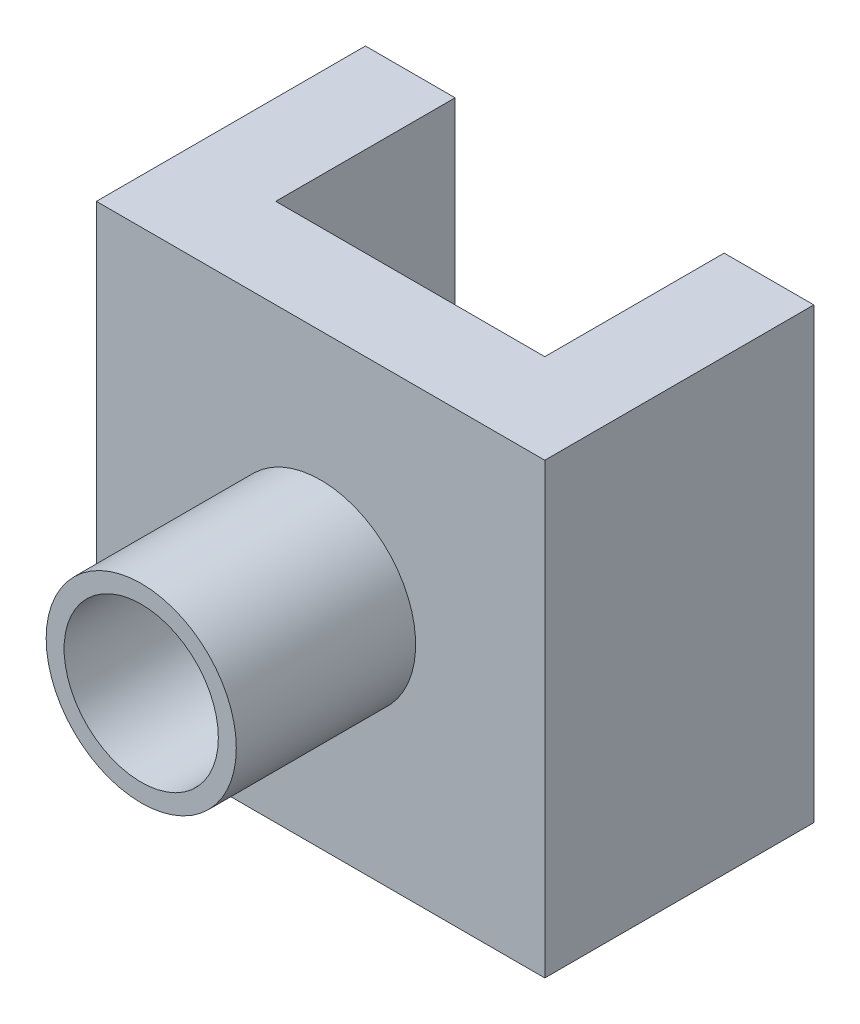
ISO-10303-21;
HEADER;
FILE_DESCRIPTION(('STEP AP214'),'2;1');
FILE_NAME('part.step','',(''),(''),'','','');
FILE_SCHEMA(('AUTOMOTIVE_DESIGN { 1 0 10303 214 1 1 1 1 }'));
ENDSEC;
DATA;
#1=APPLICATION_CONTEXT('core data for automotive mechanical design processes');
#2=APPLICATION_PROTOCOL_DEFINITION('international standard','automotive_design',2000,#1);
#3=PRODUCT_CONTEXT('',#1,'mechanical');
#4=PRODUCT('Part','Part','',(#3));
#5=PRODUCT_RELATED_PRODUCT_CATEGORY('part','',(#4));
#6=PRODUCT_DEFINITION_FORMATION('','',#4);
#7=PRODUCT_DEFINITION_CONTEXT('part definition',#1,'design');
#8=PRODUCT_DEFINITION('design','',#6,#7);
#9=PRODUCT_DEFINITION_SHAPE('','',#8);
#10=(LENGTH_UNIT() NAMED_UNIT(*) SI_UNIT(.MILLI.,.METRE.));
#11=(NAMED_UNIT(*) PLANE_ANGLE_UNIT() SI_UNIT($,.RADIAN.));
#12=(NAMED_UNIT(*) SI_UNIT($,.STERADIAN.) SOLID_ANGLE_UNIT());
#13=UNCERTAINTY_MEASURE_WITH_UNIT(LENGTH_MEASURE(1.E-05),#10,'distance_accuracy_value','');
#14=(GEOMETRIC_REPRESENTATION_CONTEXT(3) GLOBAL_UNCERTAINTY_ASSIGNED_CONTEXT((#13)) GLOBAL_UNIT_ASSIGNED_CONTEXT((#10,
#11,#12)) REPRESENTATION_CONTEXT('',''));
#15=CARTESIAN_POINT('',(0.,0.,0.));
#16=DIRECTION('',(0.,0.,1.));
#17=DIRECTION('',(1.,0.,0.));
#18=AXIS2_PLACEMENT_3D('',#15,#16,#17);
#19=CARTESIAN_POINT('',(0.,0.,0.));
#20=DIRECTION('',(0.,0.,-1.));
#21=DIRECTION('',(-1.,0.,0.));
#22=AXIS2_PLACEMENT_3D('',#19,#20,#21);
#23=PLANE('',#22);
#24=DIRECTION('',(0.,1.,0.));
#25=VECTOR('',#24,1.);
#26=CARTESIAN_POINT('',(5.,-3.,0.));
#27=LINE('',#26,#25);
#28=CARTESIAN_POINT('',(5.,0.,0.));
#29=VERTEX_POINT('',#28);
#30=CARTESIAN_POINT('',(5.,25.,0.));
#31=VERTEX_POINT('',#30);
#32=EDGE_CURVE('E138',#29,#31,#27,.T.);
#33=ORIENTED_EDGE('',*,*,#32,.F.);
#34=DIRECTION('',(1.,0.,0.));
#35=VECTOR('',#34,1.);
#36=CARTESIAN_POINT('',(0.,0.,0.));
#37=LINE('',#36,#35);
#38=CARTESIAN_POINT('',(0.,0.,0.));
#39=VERTEX_POINT('',#38);
#40=EDGE_CURVE('E189',#39,#29,#37,.T.);
#41=ORIENTED_EDGE('',*,*,#40,.F.);
#42=DIRECTION('',(0.,-1.,0.));
#43=VECTOR('',#42,1.);
#44=CARTESIAN_POINT('',(0.,0.,0.));
#45=LINE('',#44,#43);
#46=CARTESIAN_POINT('',(0.,25.,0.));
#47=VERTEX_POINT('',#46);
#48=EDGE_CURVE('E172',#47,#39,#45,.T.);
#49=ORIENTED_EDGE('',*,*,#48,.F.);
#50=DIRECTION('',(-1.,0.,0.));
#51=VECTOR('',#50,1.);
#52=CARTESIAN_POINT('',(0.,25.,0.));
#53=LINE('',#52,#51);
#54=EDGE_CURVE('E92',#31,#47,#53,.T.);
#55=ORIENTED_EDGE('',*,*,#54,.F.);
#56=EDGE_LOOP('',(#33,#41,#49,#55));
#57=FACE_BOUND('',#56,.T.);
#58=ADVANCED_FACE('F45',(#57),#23,.T.);
#59=CARTESIAN_POINT('',(0.,0.,15.));
#60=DIRECTION('',(0.,0.,-1.));
#61=DIRECTION('',(-1.,0.,0.));
#62=AXIS2_PLACEMENT_3D('',#59,#60,#61);
#63=PLANE('',#62);
#64=DIRECTION('',(0.,-1.,0.));
#65=VECTOR('',#64,1.);
#66=CARTESIAN_POINT('',(0.,0.,15.));
#67=LINE('',#66,#65);
#68=CARTESIAN_POINT('',(0.,25.,15.));
#69=VERTEX_POINT('',#68);
#70=CARTESIAN_POINT('',(0.,0.,15.));
#71=VERTEX_POINT('',#70);
#72=EDGE_CURVE('E173',#69,#71,#67,.T.);
#73=ORIENTED_EDGE('',*,*,#72,.T.);
#74=DIRECTION('',(1.,0.,0.));
#75=VECTOR('',#74,1.);
#76=CARTESIAN_POINT('',(0.,0.,15.));
#77=LINE('',#76,#75);
#78=CARTESIAN_POINT('',(25.,0.,15.));
#79=VERTEX_POINT('',#78);
#80=EDGE_CURVE('E100',#71,#79,#77,.T.);
#81=ORIENTED_EDGE('',*,*,#80,.T.);
#82=DIRECTION('',(0.,1.,0.));
#83=VECTOR('',#82,1.);
#84=CARTESIAN_POINT('',(25.,0.,15.));
#85=LINE('',#84,#83);
#86=CARTESIAN_POINT('',(25.,25.,15.));
#87=VERTEX_POINT('',#86);
#88=EDGE_CURVE('E179',#79,#87,#85,.T.);
#89=ORIENTED_EDGE('',*,*,#88,.T.);
#90=DIRECTION('',(-1.,0.,0.));
#91=VECTOR('',#90,1.);
#92=CARTESIAN_POINT('',(0.,25.,15.));
#93=LINE('',#92,#91);
#94=EDGE_CURVE('E71',#87,#69,#93,.T.);
#95=ORIENTED_EDGE('',*,*,#94,.T.);
#96=EDGE_LOOP('',(#73,#81,#89,#95));
#97=FACE_BOUND('',#96,.T.);
#98=CARTESIAN_POINT('',(12.5,12.5,15.));
#99=DIRECTION('',(0.,0.,-1.));
#100=DIRECTION('',(-1.,0.,0.));
#101=AXIS2_PLACEMENT_3D('',#98,#99,#100);
#102=CIRCLE('',#101,5.3);
#103=CARTESIAN_POINT('',(7.2,12.5,15.));
#104=VERTEX_POINT('',#103);
#105=EDGE_CURVE('E11',#104,#104,#102,.F.);
#106=ORIENTED_EDGE('',*,*,#105,.F.);
#107=EDGE_LOOP('',(#106));
#108=FACE_BOUND('',#107,.T.);
#109=ADVANCED_FACE('F233',(#97,#108),#63,.F.);
#110=CARTESIAN_POINT('',(0.,0.,15.));
#111=DIRECTION('',(1.,0.,0.));
#112=DIRECTION('',(0.,0.,-1.));
#113=AXIS2_PLACEMENT_3D('',#110,#111,#112);
#114=PLANE('',#113);
#115=ORIENTED_EDGE('',*,*,#48,.T.);
#116=DIRECTION('',(0.,0.,-1.));
#117=VECTOR('',#116,1.);
#118=CARTESIAN_POINT('',(0.,0.,15.));
#119=LINE('',#118,#117);
#120=EDGE_CURVE('E55',#71,#39,#119,.T.);
#121=ORIENTED_EDGE('',*,*,#120,.F.);
#122=ORIENTED_EDGE('',*,*,#72,.F.);
#123=DIRECTION('',(0.,0.,-1.));
#124=VECTOR('',#123,1.);
#125=CARTESIAN_POINT('',(0.,25.,15.));
#126=LINE('',#125,#124);
#127=EDGE_CURVE('E184',#69,#47,#126,.T.);
#128=ORIENTED_EDGE('',*,*,#127,.T.);
#129=EDGE_LOOP('',(#115,#121,#122,#128));
#130=FACE_BOUND('',#129,.T.);
#131=ADVANCED_FACE('F47',(#130),#114,.F.);
#132=CARTESIAN_POINT('',(0.,0.,15.));
#133=DIRECTION('',(0.,1.,0.));
#134=DIRECTION('',(0.,0.,1.));
#135=AXIS2_PLACEMENT_3D('',#132,#133,#134);
#136=PLANE('',#135);
#137=ORIENTED_EDGE('',*,*,#40,.T.);
#138=DIRECTION('',(0.,0.,1.));
#139=VECTOR('',#138,1.);
#140=CARTESIAN_POINT('',(5.,0.,15.));
#141=LINE('',#140,#139);
#142=CARTESIAN_POINT('',(5.,0.,10.));
#143=VERTEX_POINT('',#142);
#144=EDGE_CURVE('E161',#29,#143,#141,.T.);
#145=ORIENTED_EDGE('',*,*,#144,.T.);
#146=DIRECTION('',(1.,0.,0.));
#147=VECTOR('',#146,1.);
#148=CARTESIAN_POINT('',(0.,0.,10.));
#149=LINE('',#148,#147);
#150=CARTESIAN_POINT('',(20.,0.,10.));
#151=VERTEX_POINT('',#150);
#152=EDGE_CURVE('E129',#143,#151,#149,.T.);
#153=ORIENTED_EDGE('',*,*,#152,.T.);
#154=DIRECTION('',(0.,0.,-1.));
#155=VECTOR('',#154,1.);
#156=CARTESIAN_POINT('',(20.,0.,15.));
#157=LINE('',#156,#155);
#158=CARTESIAN_POINT('',(20.,0.,0.));
#159=VERTEX_POINT('',#158);
#160=EDGE_CURVE('E157',#151,#159,#157,.T.);
#161=ORIENTED_EDGE('',*,*,#160,.T.);
#162=CARTESIAN_POINT('',(25.,0.,0.));
#163=VERTEX_POINT('',#162);
#164=EDGE_CURVE('E188',#159,#163,#37,.T.);
#165=ORIENTED_EDGE('',*,*,#164,.T.);
#166=DIRECTION('',(0.,0.,-1.));
#167=VECTOR('',#166,1.);
#168=CARTESIAN_POINT('',(25.,0.,15.));
#169=LINE('',#168,#167);
#170=EDGE_CURVE('E204',#79,#163,#169,.T.);
#171=ORIENTED_EDGE('',*,*,#170,.F.);
#172=ORIENTED_EDGE('',*,*,#80,.F.);
#173=ORIENTED_EDGE('',*,*,#120,.T.);
#174=EDGE_LOOP('',(#137,#145,#153,#161,#165,#171,#172,#173));
#175=FACE_BOUND('',#174,.T.);
#176=ADVANCED_FACE('F210',(#175),#136,.F.);
#177=CARTESIAN_POINT('',(25.,0.,15.));
#178=DIRECTION('',(-1.,0.,0.));
#179=DIRECTION('',(0.,0.,1.));
#180=AXIS2_PLACEMENT_3D('',#177,#178,#179);
#181=PLANE('',#180);
#182=DIRECTION('',(0.,1.,0.));
#183=VECTOR('',#182,1.);
#184=CARTESIAN_POINT('',(25.,0.,0.));
#185=LINE('',#184,#183);
#186=CARTESIAN_POINT('',(25.,25.,0.));
#187=VERTEX_POINT('',#186);
#188=EDGE_CURVE('E193',#163,#187,#185,.T.);
#189=ORIENTED_EDGE('',*,*,#188,.T.);
#190=DIRECTION('',(0.,0.,-1.));
#191=VECTOR('',#190,1.);
#192=CARTESIAN_POINT('',(25.,25.,15.));
#193=LINE('',#192,#191);
#194=EDGE_CURVE('E200',#87,#187,#193,.T.);
#195=ORIENTED_EDGE('',*,*,#194,.F.);
#196=ORIENTED_EDGE('',*,*,#88,.F.);
#197=ORIENTED_EDGE('',*,*,#170,.T.);
#198=EDGE_LOOP('',(#189,#195,#196,#197));
#199=FACE_BOUND('',#198,.T.);
#200=ADVANCED_FACE('F251',(#199),#181,.F.);
#201=CARTESIAN_POINT('',(0.,25.,15.));
#202=DIRECTION('',(0.,-1.,0.));
#203=DIRECTION('',(0.,0.,-1.));
#204=AXIS2_PLACEMENT_3D('',#201,#202,#203);
#205=PLANE('',#204);
#206=DIRECTION('',(1.,0.,0.));
#207=VECTOR('',#206,1.);
#208=CARTESIAN_POINT('',(5.,25.,10.));
#209=LINE('',#208,#207);
#210=CARTESIAN_POINT('',(5.,25.,10.));
#211=VERTEX_POINT('',#210);
#212=CARTESIAN_POINT('',(20.,25.,10.));
#213=VERTEX_POINT('',#212);
#214=EDGE_CURVE('E127',#211,#213,#209,.T.);
#215=ORIENTED_EDGE('',*,*,#214,.F.);
#216=DIRECTION('',(0.,0.,1.));
#217=VECTOR('',#216,1.);
#218=CARTESIAN_POINT('',(5.,25.,0.));
#219=LINE('',#218,#217);
#220=EDGE_CURVE('E135',#31,#211,#219,.T.);
#221=ORIENTED_EDGE('',*,*,#220,.F.);
#222=ORIENTED_EDGE('',*,*,#54,.T.);
#223=ORIENTED_EDGE('',*,*,#127,.F.);
#224=ORIENTED_EDGE('',*,*,#94,.F.);
#225=ORIENTED_EDGE('',*,*,#194,.T.);
#226=CARTESIAN_POINT('',(20.,25.,0.));
#227=VERTEX_POINT('',#226);
#228=EDGE_CURVE('E176',#187,#227,#53,.T.);
#229=ORIENTED_EDGE('',*,*,#228,.T.);
#230=DIRECTION('',(0.,0.,-1.));
#231=VECTOR('',#230,1.);
#232=CARTESIAN_POINT('',(20.,25.,0.));
#233=LINE('',#232,#231);
#234=EDGE_CURVE('E62',#213,#227,#233,.T.);
#235=ORIENTED_EDGE('',*,*,#234,.F.);
#236=EDGE_LOOP('',(#215,#221,#222,#223,#224,#225,#229,#235));
#237=FACE_BOUND('',#236,.T.);
#238=ADVANCED_FACE('F141',(#237),#205,.F.);
#239=DIRECTION('',(0.,1.,0.));
#240=VECTOR('',#239,1.);
#241=CARTESIAN_POINT('',(20.,-3.,0.));
#242=LINE('',#241,#240);
#243=EDGE_CURVE('E150',#159,#227,#242,.T.);
#244=ORIENTED_EDGE('',*,*,#243,.T.);
#245=ORIENTED_EDGE('',*,*,#228,.F.);
#246=ORIENTED_EDGE('',*,*,#188,.F.);
#247=ORIENTED_EDGE('',*,*,#164,.F.);
#248=EDGE_LOOP('',(#244,#245,#246,#247));
#249=FACE_BOUND('',#248,.T.);
#250=ADVANCED_FACE('F235',(#249),#23,.T.);
#251=CARTESIAN_POINT('',(12.5,12.5,0.));
#252=DIRECTION('',(0.,0.,1.));
#253=DIRECTION('',(1.,0.,0.));
#254=AXIS2_PLACEMENT_3D('',#251,#252,#253);
#255=CYLINDRICAL_SURFACE('',#254,4.3);
#256=CARTESIAN_POINT('',(12.5,12.5,10.));
#257=DIRECTION('',(0.,0.,1.));
#258=DIRECTION('',(1.,0.,0.));
#259=AXIS2_PLACEMENT_3D('',#256,#257,#258);
#260=CIRCLE('',#259,4.3);
#261=CARTESIAN_POINT('',(16.8,12.5,10.));
#262=VERTEX_POINT('',#261);
#263=EDGE_CURVE('E49',#262,#262,#260,.F.);
#264=ORIENTED_EDGE('',*,*,#263,.T.);
#265=EDGE_LOOP('',(#264));
#266=FACE_BOUND('',#265,.T.);
#267=CARTESIAN_POINT('',(12.5,12.5,25.));
#268=DIRECTION('',(0.,0.,1.));
#269=DIRECTION('',(1.,0.,0.));
#270=AXIS2_PLACEMENT_3D('',#267,#268,#269);
#271=CIRCLE('',#270,4.3);
#272=CARTESIAN_POINT('',(16.8,12.5,25.));
#273=VERTEX_POINT('',#272);
#274=EDGE_CURVE('E164',#273,#273,#271,.T.);
#275=ORIENTED_EDGE('',*,*,#274,.T.);
#276=EDGE_LOOP('',(#275));
#277=FACE_BOUND('',#276,.T.);
#278=ADVANCED_FACE('F221',(#266,#277),#255,.F.);
#279=CARTESIAN_POINT('',(12.5,12.5,25.));
#280=DIRECTION('',(0.,0.,1.));
#281=DIRECTION('',(1.,0.,0.));
#282=AXIS2_PLACEMENT_3D('',#279,#280,#281);
#283=PLANE('',#282);
#284=CARTESIAN_POINT('',(12.5,12.5,25.));
#285=DIRECTION('',(0.,0.,1.));
#286=DIRECTION('',(1.,0.,0.));
#287=AXIS2_PLACEMENT_3D('',#284,#285,#286);
#288=CIRCLE('',#287,5.3);
#289=CARTESIAN_POINT('',(17.8,12.5,25.));
#290=VERTEX_POINT('',#289);
#291=EDGE_CURVE('E168',#290,#290,#288,.T.);
#292=ORIENTED_EDGE('',*,*,#291,.T.);
#293=EDGE_LOOP('',(#292));
#294=FACE_BOUND('',#293,.T.);
#295=ORIENTED_EDGE('',*,*,#274,.F.);
#296=EDGE_LOOP('',(#295));
#297=FACE_BOUND('',#296,.T.);
#298=ADVANCED_FACE('F249',(#294,#297),#283,.T.);
#299=CARTESIAN_POINT('',(12.5,12.5,25.));
#300=DIRECTION('',(0.,0.,-1.));
#301=DIRECTION('',(-1.,0.,0.));
#302=AXIS2_PLACEMENT_3D('',#299,#300,#301);
#303=CYLINDRICAL_SURFACE('',#302,5.3);
#304=ORIENTED_EDGE('',*,*,#291,.F.);
#305=EDGE_LOOP('',(#304));
#306=FACE_BOUND('',#305,.T.);
#307=ORIENTED_EDGE('',*,*,#105,.T.);
#308=EDGE_LOOP('',(#307));
#309=FACE_BOUND('',#308,.T.);
#310=ADVANCED_FACE('F261',(#306,#309),#303,.T.);
#311=CARTESIAN_POINT('',(5.,-3.,0.));
#312=DIRECTION('',(-1.,0.,0.));
#313=DIRECTION('',(0.,0.,1.));
#314=AXIS2_PLACEMENT_3D('',#311,#312,#313);
#315=PLANE('',#314);
#316=ORIENTED_EDGE('',*,*,#32,.T.);
#317=ORIENTED_EDGE('',*,*,#220,.T.);
#318=DIRECTION('',(0.,1.,0.));
#319=VECTOR('',#318,1.);
#320=CARTESIAN_POINT('',(5.,-3.,10.));
#321=LINE('',#320,#319);
#322=EDGE_CURVE('E122',#143,#211,#321,.T.);
#323=ORIENTED_EDGE('',*,*,#322,.F.);
#324=ORIENTED_EDGE('',*,*,#144,.F.);
#325=EDGE_LOOP('',(#316,#317,#323,#324));
#326=FACE_BOUND('',#325,.T.);
#327=ADVANCED_FACE('F136',(#326),#315,.F.);
#328=CARTESIAN_POINT('',(20.,-3.,0.));
#329=DIRECTION('',(1.,0.,0.));
#330=DIRECTION('',(0.,0.,-1.));
#331=AXIS2_PLACEMENT_3D('',#328,#329,#330);
#332=PLANE('',#331);
#333=DIRECTION('',(0.,1.,0.));
#334=VECTOR('',#333,1.);
#335=CARTESIAN_POINT('',(20.,-3.,10.));
#336=LINE('',#335,#334);
#337=EDGE_CURVE('E133',#151,#213,#336,.T.);
#338=ORIENTED_EDGE('',*,*,#337,.T.);
#339=ORIENTED_EDGE('',*,*,#234,.T.);
#340=ORIENTED_EDGE('',*,*,#243,.F.);
#341=ORIENTED_EDGE('',*,*,#160,.F.);
#342=EDGE_LOOP('',(#338,#339,#340,#341));
#343=FACE_BOUND('',#342,.T.);
#344=ADVANCED_FACE('F225',(#343),#332,.F.);
#345=CARTESIAN_POINT('',(5.,-3.,10.));
#346=DIRECTION('',(0.,0.,1.));
#347=DIRECTION('',(1.,0.,0.));
#348=AXIS2_PLACEMENT_3D('',#345,#346,#347);
#349=PLANE('',#348);
#350=ORIENTED_EDGE('',*,*,#263,.F.);
#351=EDGE_LOOP('',(#350));
#352=FACE_BOUND('',#351,.T.);
#353=ORIENTED_EDGE('',*,*,#322,.T.);
#354=ORIENTED_EDGE('',*,*,#214,.T.);
#355=ORIENTED_EDGE('',*,*,#337,.F.);
#356=ORIENTED_EDGE('',*,*,#152,.F.);
#357=EDGE_LOOP('',(#353,#354,#355,#356));
#358=FACE_BOUND('',#357,.T.);
#359=ADVANCED_FACE('F124',(#352,#358),#349,.F.);
#360=CLOSED_SHELL('',(#58,#109,#131,#176,#200,#238,#250,#278,#298,#310,#327,#344,#359));
#361=MANIFOLD_SOLID_BREP('B2',#360);
#362=ADVANCED_BREP_SHAPE_REPRESENTATION('',(#18,#361),#14);
#363=SHAPE_DEFINITION_REPRESENTATION(#9,#362);
ENDSEC;
END-ISO-10303-21;
